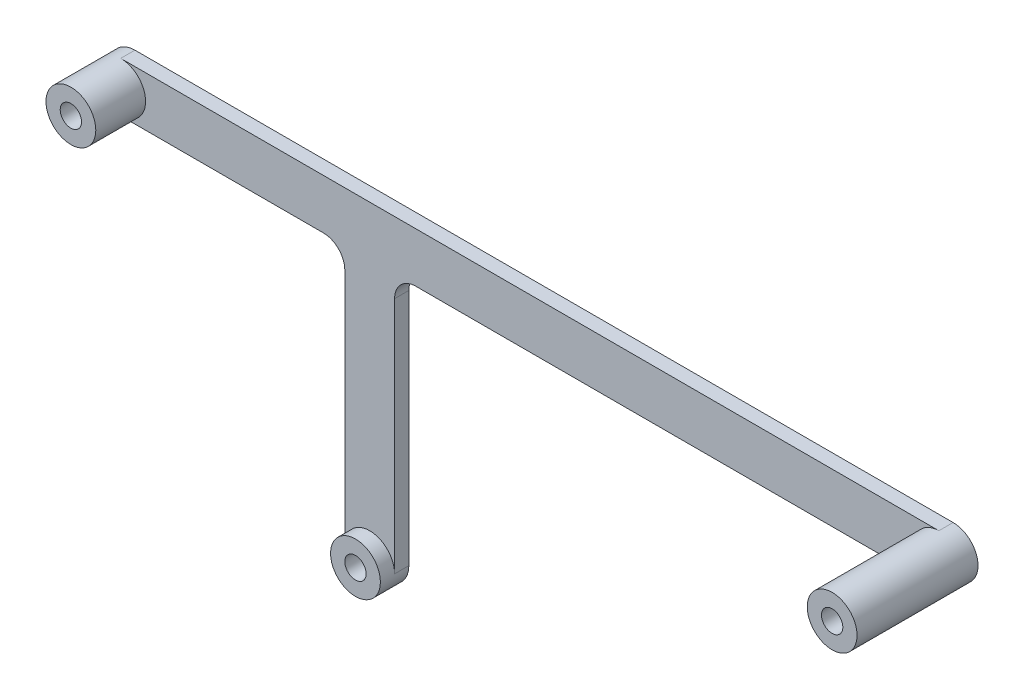
ISO-10303-21;
HEADER;
FILE_DESCRIPTION(('STEP AP214'),'2;1');
FILE_NAME('part.step','',(''),(''),'','','');
FILE_SCHEMA(('AUTOMOTIVE_DESIGN { 1 0 10303 214 1 1 1 1 }'));
ENDSEC;
DATA;
#1=APPLICATION_CONTEXT('core data for automotive mechanical design processes');
#2=APPLICATION_PROTOCOL_DEFINITION('international standard','automotive_design',2000,#1);
#3=PRODUCT_CONTEXT('',#1,'mechanical');
#4=PRODUCT('Part','Part','',(#3));
#5=PRODUCT_RELATED_PRODUCT_CATEGORY('part','',(#4));
#6=PRODUCT_DEFINITION_FORMATION('','',#4);
#7=PRODUCT_DEFINITION_CONTEXT('part definition',#1,'design');
#8=PRODUCT_DEFINITION('design','',#6,#7);
#9=PRODUCT_DEFINITION_SHAPE('','',#8);
#10=(LENGTH_UNIT() NAMED_UNIT(*) SI_UNIT(.MILLI.,.METRE.));
#11=(NAMED_UNIT(*) PLANE_ANGLE_UNIT() SI_UNIT($,.RADIAN.));
#12=(NAMED_UNIT(*) SI_UNIT($,.STERADIAN.) SOLID_ANGLE_UNIT());
#13=UNCERTAINTY_MEASURE_WITH_UNIT(LENGTH_MEASURE(1.E-05),#10,'distance_accuracy_value','');
#14=(GEOMETRIC_REPRESENTATION_CONTEXT(3) GLOBAL_UNCERTAINTY_ASSIGNED_CONTEXT((#13)) GLOBAL_UNIT_ASSIGNED_CONTEXT((#10,
#11,#12)) REPRESENTATION_CONTEXT('',''));
#15=CARTESIAN_POINT('',(0.,0.,0.));
#16=DIRECTION('',(0.,0.,1.));
#17=DIRECTION('',(1.,0.,0.));
#18=AXIS2_PLACEMENT_3D('',#15,#16,#17);
#19=CARTESIAN_POINT('',(-35.,40.,2.));
#20=DIRECTION('',(0.,0.,1.));
#21=DIRECTION('',(1.,0.,0.));
#22=AXIS2_PLACEMENT_3D('',#19,#20,#21);
#23=PLANE('',#22);
#24=DIRECTION('',(0.,-1.,0.));
#25=VECTOR('',#24,1.);
#26=CARTESIAN_POINT('',(-3.5,0.,2.));
#27=LINE('',#26,#25);
#28=CARTESIAN_POINT('',(-3.5,33.5,2.));
#29=VERTEX_POINT('',#28);
#30=CARTESIAN_POINT('',(-3.5,0.,2.));
#31=VERTEX_POINT('',#30);
#32=EDGE_CURVE('E137',#29,#31,#27,.T.);
#33=ORIENTED_EDGE('',*,*,#32,.T.);
#34=CARTESIAN_POINT('',(0.,0.,2.));
#35=DIRECTION('',(0.,0.,1.));
#36=DIRECTION('',(1.,0.,0.));
#37=AXIS2_PLACEMENT_3D('',#34,#35,#36);
#38=CIRCLE('',#37,3.5);
#39=CARTESIAN_POINT('',(3.5,0.,2.));
#40=VERTEX_POINT('',#39);
#41=EDGE_CURVE('E132',#40,#31,#38,.T.);
#42=ORIENTED_EDGE('',*,*,#41,.F.);
#43=DIRECTION('',(0.,1.,0.));
#44=VECTOR('',#43,1.);
#45=CARTESIAN_POINT('',(3.5,0.,2.));
#46=LINE('',#45,#44);
#47=CARTESIAN_POINT('',(3.5,33.5,2.));
#48=VERTEX_POINT('',#47);
#49=EDGE_CURVE('E125',#40,#48,#46,.T.);
#50=ORIENTED_EDGE('',*,*,#49,.T.);
#51=CARTESIAN_POINT('',(6.5,33.5,2.));
#52=DIRECTION('',(0.,0.,-1.));
#53=DIRECTION('',(1.,0.,0.));
#54=AXIS2_PLACEMENT_3D('',#51,#52,#53);
#55=CIRCLE('',#54,3.);
#56=CARTESIAN_POINT('',(6.50000000000002,36.5,2.));
#57=VERTEX_POINT('',#56);
#58=EDGE_CURVE('E128',#48,#57,#55,.T.);
#59=ORIENTED_EDGE('',*,*,#58,.T.);
#60=DIRECTION('',(1.,0.,0.));
#61=VECTOR('',#60,1.);
#62=CARTESIAN_POINT('',(6.50000000000002,36.5,2.));
#63=LINE('',#62,#61);
#64=CARTESIAN_POINT('',(80.,36.5,2.));
#65=VERTEX_POINT('',#64);
#66=EDGE_CURVE('E62',#57,#65,#63,.T.);
#67=ORIENTED_EDGE('',*,*,#66,.T.);
#68=CARTESIAN_POINT('',(80.,40.,2.));
#69=DIRECTION('',(0.,0.,1.));
#70=DIRECTION('',(1.,0.,0.));
#71=AXIS2_PLACEMENT_3D('',#68,#69,#70);
#72=CIRCLE('',#71,3.50000000000001);
#73=CARTESIAN_POINT('',(80.,43.5,2.));
#74=VERTEX_POINT('',#73);
#75=EDGE_CURVE('E264',#74,#65,#72,.T.);
#76=ORIENTED_EDGE('',*,*,#75,.F.);
#77=DIRECTION('',(-1.,0.,0.));
#78=VECTOR('',#77,1.);
#79=CARTESIAN_POINT('',(-35.,43.5,2.));
#80=LINE('',#79,#78);
#81=CARTESIAN_POINT('',(-35.,43.5,2.));
#82=VERTEX_POINT('',#81);
#83=EDGE_CURVE('E155',#74,#82,#80,.T.);
#84=ORIENTED_EDGE('',*,*,#83,.T.);
#85=CARTESIAN_POINT('',(-35.,40.,2.));
#86=DIRECTION('',(0.,0.,1.));
#87=DIRECTION('',(1.,0.,0.));
#88=AXIS2_PLACEMENT_3D('',#85,#86,#87);
#89=CIRCLE('',#88,3.5);
#90=CARTESIAN_POINT('',(-35.,36.5,2.));
#91=VERTEX_POINT('',#90);
#92=EDGE_CURVE('E11',#91,#82,#89,.T.);
#93=ORIENTED_EDGE('',*,*,#92,.F.);
#94=DIRECTION('',(1.,0.,0.));
#95=VECTOR('',#94,1.);
#96=CARTESIAN_POINT('',(-35.,36.5,2.));
#97=LINE('',#96,#95);
#98=CARTESIAN_POINT('',(-6.50000000000002,36.5,2.));
#99=VERTEX_POINT('',#98);
#100=EDGE_CURVE('E191',#91,#99,#97,.T.);
#101=ORIENTED_EDGE('',*,*,#100,.T.);
#102=CARTESIAN_POINT('',(-6.5,33.5,2.));
#103=DIRECTION('',(0.,0.,-1.));
#104=DIRECTION('',(-1.,0.,0.));
#105=AXIS2_PLACEMENT_3D('',#102,#103,#104);
#106=CIRCLE('',#105,3.);
#107=EDGE_CURVE('E238',#99,#29,#106,.T.);
#108=ORIENTED_EDGE('',*,*,#107,.T.);
#109=EDGE_LOOP('',(#33,#42,#50,#59,#67,#76,#84,#93,#101,#108));
#110=FACE_BOUND('',#109,.T.);
#111=ADVANCED_FACE('F43',(#110),#23,.T.);
#112=CARTESIAN_POINT('',(-35.,40.,0.));
#113=DIRECTION('',(0.,0.,1.));
#114=DIRECTION('',(1.,0.,0.));
#115=AXIS2_PLACEMENT_3D('',#112,#113,#114);
#116=PLANE('',#115);
#117=CARTESIAN_POINT('',(-35.,40.,0.));
#118=DIRECTION('',(0.,0.,1.));
#119=DIRECTION('',(1.,0.,0.));
#120=AXIS2_PLACEMENT_3D('',#117,#118,#119);
#121=CIRCLE('',#120,3.5);
#122=CARTESIAN_POINT('',(-35.,43.5,0.));
#123=VERTEX_POINT('',#122);
#124=CARTESIAN_POINT('',(-35.,36.5,0.));
#125=VERTEX_POINT('',#124);
#126=EDGE_CURVE('E162',#123,#125,#121,.T.);
#127=ORIENTED_EDGE('',*,*,#126,.F.);
#128=DIRECTION('',(-1.,0.,0.));
#129=VECTOR('',#128,1.);
#130=CARTESIAN_POINT('',(-35.,43.5,0.));
#131=LINE('',#130,#129);
#132=CARTESIAN_POINT('',(80.,43.5,0.));
#133=VERTEX_POINT('',#132);
#134=EDGE_CURVE('E105',#133,#123,#131,.T.);
#135=ORIENTED_EDGE('',*,*,#134,.F.);
#136=CARTESIAN_POINT('',(80.,40.,0.));
#137=DIRECTION('',(0.,0.,1.));
#138=DIRECTION('',(1.,0.,0.));
#139=AXIS2_PLACEMENT_3D('',#136,#137,#138);
#140=CIRCLE('',#139,3.5);
#141=CARTESIAN_POINT('',(80.,36.5,0.));
#142=VERTEX_POINT('',#141);
#143=EDGE_CURVE('E98',#142,#133,#140,.T.);
#144=ORIENTED_EDGE('',*,*,#143,.F.);
#145=DIRECTION('',(1.,0.,0.));
#146=VECTOR('',#145,1.);
#147=CARTESIAN_POINT('',(6.50000000000002,36.5,0.));
#148=LINE('',#147,#146);
#149=CARTESIAN_POINT('',(6.50000000000002,36.5,0.));
#150=VERTEX_POINT('',#149);
#151=EDGE_CURVE('E184',#150,#142,#148,.T.);
#152=ORIENTED_EDGE('',*,*,#151,.F.);
#153=CARTESIAN_POINT('',(6.5,33.5,0.));
#154=DIRECTION('',(0.,0.,-1.));
#155=DIRECTION('',(1.,0.,0.));
#156=AXIS2_PLACEMENT_3D('',#153,#154,#155);
#157=CIRCLE('',#156,3.);
#158=CARTESIAN_POINT('',(3.5,33.5,0.));
#159=VERTEX_POINT('',#158);
#160=EDGE_CURVE('E181',#159,#150,#157,.T.);
#161=ORIENTED_EDGE('',*,*,#160,.F.);
#162=DIRECTION('',(0.,1.,0.));
#163=VECTOR('',#162,1.);
#164=CARTESIAN_POINT('',(3.5,0.,0.));
#165=LINE('',#164,#163);
#166=CARTESIAN_POINT('',(3.5,0.,0.));
#167=VERTEX_POINT('',#166);
#168=EDGE_CURVE('E143',#167,#159,#165,.T.);
#169=ORIENTED_EDGE('',*,*,#168,.F.);
#170=CARTESIAN_POINT('',(0.,0.,0.));
#171=DIRECTION('',(0.,0.,1.));
#172=DIRECTION('',(1.,0.,0.));
#173=AXIS2_PLACEMENT_3D('',#170,#171,#172);
#174=CIRCLE('',#173,3.5);
#175=CARTESIAN_POINT('',(-3.5,0.,0.));
#176=VERTEX_POINT('',#175);
#177=EDGE_CURVE('E176',#176,#167,#174,.T.);
#178=ORIENTED_EDGE('',*,*,#177,.F.);
#179=DIRECTION('',(0.,-1.,0.));
#180=VECTOR('',#179,1.);
#181=CARTESIAN_POINT('',(-3.5,0.,0.));
#182=LINE('',#181,#180);
#183=CARTESIAN_POINT('',(-3.5,33.5,0.));
#184=VERTEX_POINT('',#183);
#185=EDGE_CURVE('E173',#184,#176,#182,.T.);
#186=ORIENTED_EDGE('',*,*,#185,.F.);
#187=CARTESIAN_POINT('',(-6.5,33.5,0.));
#188=DIRECTION('',(0.,0.,-1.));
#189=DIRECTION('',(-1.,0.,0.));
#190=AXIS2_PLACEMENT_3D('',#187,#188,#189);
#191=CIRCLE('',#190,3.);
#192=CARTESIAN_POINT('',(-6.50000000000002,36.5,0.));
#193=VERTEX_POINT('',#192);
#194=EDGE_CURVE('E170',#193,#184,#191,.T.);
#195=ORIENTED_EDGE('',*,*,#194,.F.);
#196=DIRECTION('',(1.,0.,0.));
#197=VECTOR('',#196,1.);
#198=CARTESIAN_POINT('',(-35.,36.5,0.));
#199=LINE('',#198,#197);
#200=EDGE_CURVE('E166',#125,#193,#199,.T.);
#201=ORIENTED_EDGE('',*,*,#200,.F.);
#202=EDGE_LOOP('',(#127,#135,#144,#152,#161,#169,#178,#186,#195,#201));
#203=FACE_BOUND('',#202,.T.);
#204=CARTESIAN_POINT('',(-35.,40.,0.));
#205=DIRECTION('',(0.,0.,1.));
#206=DIRECTION('',(1.,0.,0.));
#207=AXIS2_PLACEMENT_3D('',#204,#205,#206);
#208=CIRCLE('',#207,1.5);
#209=CARTESIAN_POINT('',(-33.5,40.,0.));
#210=VERTEX_POINT('',#209);
#211=EDGE_CURVE('E167',#210,#210,#208,.T.);
#212=ORIENTED_EDGE('',*,*,#211,.T.);
#213=EDGE_LOOP('',(#212));
#214=FACE_BOUND('',#213,.T.);
#215=CARTESIAN_POINT('',(80.,40.,0.));
#216=DIRECTION('',(0.,0.,1.));
#217=DIRECTION('',(1.,0.,0.));
#218=AXIS2_PLACEMENT_3D('',#215,#216,#217);
#219=CIRCLE('',#218,1.5);
#220=CARTESIAN_POINT('',(81.5,40.,0.));
#221=VERTEX_POINT('',#220);
#222=EDGE_CURVE('E247',#221,#221,#219,.T.);
#223=ORIENTED_EDGE('',*,*,#222,.T.);
#224=EDGE_LOOP('',(#223));
#225=FACE_BOUND('',#224,.T.);
#226=CARTESIAN_POINT('',(0.,0.,0.));
#227=DIRECTION('',(0.,0.,1.));
#228=DIRECTION('',(1.,0.,0.));
#229=AXIS2_PLACEMENT_3D('',#226,#227,#228);
#230=CIRCLE('',#229,1.5);
#231=CARTESIAN_POINT('',(1.5,0.,0.));
#232=VERTEX_POINT('',#231);
#233=EDGE_CURVE('E251',#232,#232,#230,.T.);
#234=ORIENTED_EDGE('',*,*,#233,.T.);
#235=EDGE_LOOP('',(#234));
#236=FACE_BOUND('',#235,.T.);
#237=ADVANCED_FACE('F227',(#203,#214,#225,#236),#116,.F.);
#238=CARTESIAN_POINT('',(-35.,40.,2.));
#239=DIRECTION('',(0.,0.,-1.));
#240=DIRECTION('',(-1.,0.,0.));
#241=AXIS2_PLACEMENT_3D('',#238,#239,#240);
#242=CYLINDRICAL_SURFACE('',#241,3.5);
#243=ORIENTED_EDGE('',*,*,#126,.T.);
#244=DIRECTION('',(0.,0.,-1.));
#245=VECTOR('',#244,1.);
#246=CARTESIAN_POINT('',(-35.,36.5,2.));
#247=LINE('',#246,#245);
#248=EDGE_CURVE('E47',#91,#125,#247,.T.);
#249=ORIENTED_EDGE('',*,*,#248,.F.);
#250=ORIENTED_EDGE('',*,*,#92,.T.);
#251=DIRECTION('',(0.,0.,-1.));
#252=VECTOR('',#251,1.);
#253=CARTESIAN_POINT('',(-35.,43.5,2.));
#254=LINE('',#253,#252);
#255=EDGE_CURVE('E161',#82,#123,#254,.T.);
#256=ORIENTED_EDGE('',*,*,#255,.T.);
#257=EDGE_LOOP('',(#243,#249,#250,#256));
#258=FACE_BOUND('',#257,.T.);
#259=CARTESIAN_POINT('',(-35.,40.,9.));
#260=DIRECTION('',(0.,0.,1.));
#261=DIRECTION('',(1.,0.,0.));
#262=AXIS2_PLACEMENT_3D('',#259,#260,#261);
#263=CIRCLE('',#262,3.5);
#264=CARTESIAN_POINT('',(-31.5,40.,9.));
#265=VERTEX_POINT('',#264);
#266=EDGE_CURVE('E254',#265,#265,#263,.T.);
#267=ORIENTED_EDGE('',*,*,#266,.F.);
#268=EDGE_LOOP('',(#267));
#269=FACE_BOUND('',#268,.T.);
#270=ADVANCED_FACE('F45',(#258,#269),#242,.T.);
#271=CARTESIAN_POINT('',(-35.,36.5,2.));
#272=DIRECTION('',(0.,1.,0.));
#273=DIRECTION('',(0.,0.,1.));
#274=AXIS2_PLACEMENT_3D('',#271,#272,#273);
#275=PLANE('',#274);
#276=ORIENTED_EDGE('',*,*,#200,.T.);
#277=DIRECTION('',(0.,0.,-1.));
#278=VECTOR('',#277,1.);
#279=CARTESIAN_POINT('',(-6.50000000000002,36.5,2.));
#280=LINE('',#279,#278);
#281=EDGE_CURVE('E211',#99,#193,#280,.T.);
#282=ORIENTED_EDGE('',*,*,#281,.F.);
#283=ORIENTED_EDGE('',*,*,#100,.F.);
#284=ORIENTED_EDGE('',*,*,#248,.T.);
#285=EDGE_LOOP('',(#276,#282,#283,#284));
#286=FACE_BOUND('',#285,.T.);
#287=ADVANCED_FACE('F222',(#286),#275,.F.);
#288=CARTESIAN_POINT('',(-6.5,33.5,2.));
#289=DIRECTION('',(0.,0.,-1.));
#290=DIRECTION('',(-1.,0.,0.));
#291=AXIS2_PLACEMENT_3D('',#288,#289,#290);
#292=CYLINDRICAL_SURFACE('',#291,3.);
#293=ORIENTED_EDGE('',*,*,#194,.T.);
#294=DIRECTION('',(0.,0.,-1.));
#295=VECTOR('',#294,1.);
#296=CARTESIAN_POINT('',(-3.5,33.5,2.));
#297=LINE('',#296,#295);
#298=EDGE_CURVE('E208',#29,#184,#297,.T.);
#299=ORIENTED_EDGE('',*,*,#298,.F.);
#300=ORIENTED_EDGE('',*,*,#107,.F.);
#301=ORIENTED_EDGE('',*,*,#281,.T.);
#302=EDGE_LOOP('',(#293,#299,#300,#301));
#303=FACE_BOUND('',#302,.T.);
#304=ADVANCED_FACE('F232',(#303),#292,.F.);
#305=CARTESIAN_POINT('',(-3.5,0.,2.));
#306=DIRECTION('',(1.,0.,0.));
#307=DIRECTION('',(0.,1.,0.));
#308=AXIS2_PLACEMENT_3D('',#305,#306,#307);
#309=PLANE('',#308);
#310=ORIENTED_EDGE('',*,*,#185,.T.);
#311=DIRECTION('',(0.,0.,-1.));
#312=VECTOR('',#311,1.);
#313=CARTESIAN_POINT('',(-3.5,0.,2.));
#314=LINE('',#313,#312);
#315=EDGE_CURVE('E204',#31,#176,#314,.T.);
#316=ORIENTED_EDGE('',*,*,#315,.F.);
#317=ORIENTED_EDGE('',*,*,#32,.F.);
#318=ORIENTED_EDGE('',*,*,#298,.T.);
#319=EDGE_LOOP('',(#310,#316,#317,#318));
#320=FACE_BOUND('',#319,.T.);
#321=ADVANCED_FACE('F235',(#320),#309,.F.);
#322=CARTESIAN_POINT('',(0.,0.,2.));
#323=DIRECTION('',(0.,0.,-1.));
#324=DIRECTION('',(-1.,0.,0.));
#325=AXIS2_PLACEMENT_3D('',#322,#323,#324);
#326=CYLINDRICAL_SURFACE('',#325,3.5);
#327=ORIENTED_EDGE('',*,*,#177,.T.);
#328=DIRECTION('',(0.,0.,-1.));
#329=VECTOR('',#328,1.);
#330=CARTESIAN_POINT('',(3.5,0.,2.));
#331=LINE('',#330,#329);
#332=EDGE_CURVE('E147',#40,#167,#331,.T.);
#333=ORIENTED_EDGE('',*,*,#332,.F.);
#334=ORIENTED_EDGE('',*,*,#41,.T.);
#335=ORIENTED_EDGE('',*,*,#315,.T.);
#336=EDGE_LOOP('',(#327,#333,#334,#335));
#337=FACE_BOUND('',#336,.T.);
#338=CARTESIAN_POINT('',(0.,0.,4.));
#339=DIRECTION('',(0.,0.,1.));
#340=DIRECTION('',(1.,0.,0.));
#341=AXIS2_PLACEMENT_3D('',#338,#339,#340);
#342=CIRCLE('',#341,3.5);
#343=CARTESIAN_POINT('',(3.5,0.,4.));
#344=VERTEX_POINT('',#343);
#345=EDGE_CURVE('E275',#344,#344,#342,.T.);
#346=ORIENTED_EDGE('',*,*,#345,.F.);
#347=EDGE_LOOP('',(#346));
#348=FACE_BOUND('',#347,.T.);
#349=ADVANCED_FACE('F326',(#337,#348),#326,.T.);
#350=CARTESIAN_POINT('',(3.5,0.,2.));
#351=DIRECTION('',(-1.,0.,0.));
#352=DIRECTION('',(0.,0.,1.));
#353=AXIS2_PLACEMENT_3D('',#350,#351,#352);
#354=PLANE('',#353);
#355=ORIENTED_EDGE('',*,*,#168,.T.);
#356=DIRECTION('',(0.,0.,-1.));
#357=VECTOR('',#356,1.);
#358=CARTESIAN_POINT('',(3.5,33.5,2.));
#359=LINE('',#358,#357);
#360=EDGE_CURVE('E140',#48,#159,#359,.T.);
#361=ORIENTED_EDGE('',*,*,#360,.F.);
#362=ORIENTED_EDGE('',*,*,#49,.F.);
#363=ORIENTED_EDGE('',*,*,#332,.T.);
#364=EDGE_LOOP('',(#355,#361,#362,#363));
#365=FACE_BOUND('',#364,.T.);
#366=ADVANCED_FACE('F141',(#365),#354,.F.);
#367=CARTESIAN_POINT('',(6.5,33.5,2.));
#368=DIRECTION('',(0.,0.,-1.));
#369=DIRECTION('',(-1.,0.,0.));
#370=AXIS2_PLACEMENT_3D('',#367,#368,#369);
#371=CYLINDRICAL_SURFACE('',#370,3.);
#372=ORIENTED_EDGE('',*,*,#160,.T.);
#373=DIRECTION('',(0.,0.,-1.));
#374=VECTOR('',#373,1.);
#375=CARTESIAN_POINT('',(6.50000000000002,36.5,2.));
#376=LINE('',#375,#374);
#377=EDGE_CURVE('E148',#57,#150,#376,.T.);
#378=ORIENTED_EDGE('',*,*,#377,.F.);
#379=ORIENTED_EDGE('',*,*,#58,.F.);
#380=ORIENTED_EDGE('',*,*,#360,.T.);
#381=EDGE_LOOP('',(#372,#378,#379,#380));
#382=FACE_BOUND('',#381,.T.);
#383=ADVANCED_FACE('F150',(#382),#371,.F.);
#384=CARTESIAN_POINT('',(6.50000000000002,36.5,2.));
#385=DIRECTION('',(0.,1.,0.));
#386=DIRECTION('',(-1.,0.,0.));
#387=AXIS2_PLACEMENT_3D('',#384,#385,#386);
#388=PLANE('',#387);
#389=ORIENTED_EDGE('',*,*,#151,.T.);
#390=DIRECTION('',(0.,0.,-1.));
#391=VECTOR('',#390,1.);
#392=CARTESIAN_POINT('',(80.,36.5,2.));
#393=LINE('',#392,#391);
#394=EDGE_CURVE('E197',#65,#142,#393,.T.);
#395=ORIENTED_EDGE('',*,*,#394,.F.);
#396=ORIENTED_EDGE('',*,*,#66,.F.);
#397=ORIENTED_EDGE('',*,*,#377,.T.);
#398=EDGE_LOOP('',(#389,#395,#396,#397));
#399=FACE_BOUND('',#398,.T.);
#400=ADVANCED_FACE('F318',(#399),#388,.F.);
#401=CARTESIAN_POINT('',(80.,40.,2.));
#402=DIRECTION('',(0.,0.,-1.));
#403=DIRECTION('',(-1.,0.,0.));
#404=AXIS2_PLACEMENT_3D('',#401,#402,#403);
#405=CYLINDRICAL_SURFACE('',#404,3.5);
#406=ORIENTED_EDGE('',*,*,#143,.T.);
#407=DIRECTION('',(0.,0.,-1.));
#408=VECTOR('',#407,1.);
#409=CARTESIAN_POINT('',(80.,43.5,2.));
#410=LINE('',#409,#408);
#411=EDGE_CURVE('E194',#74,#133,#410,.T.);
#412=ORIENTED_EDGE('',*,*,#411,.F.);
#413=ORIENTED_EDGE('',*,*,#75,.T.);
#414=ORIENTED_EDGE('',*,*,#394,.T.);
#415=EDGE_LOOP('',(#406,#412,#413,#414));
#416=FACE_BOUND('',#415,.T.);
#417=CARTESIAN_POINT('',(80.,40.,17.));
#418=DIRECTION('',(0.,0.,1.));
#419=DIRECTION('',(1.,0.,0.));
#420=AXIS2_PLACEMENT_3D('',#417,#418,#419);
#421=CIRCLE('',#420,3.50000000000001);
#422=CARTESIAN_POINT('',(83.5,40.,17.));
#423=VERTEX_POINT('',#422);
#424=EDGE_CURVE('E263',#423,#423,#421,.T.);
#425=ORIENTED_EDGE('',*,*,#424,.F.);
#426=EDGE_LOOP('',(#425));
#427=FACE_BOUND('',#426,.T.);
#428=ADVANCED_FACE('F315',(#416,#427),#405,.T.);
#429=CARTESIAN_POINT('',(-35.,43.5,2.));
#430=DIRECTION('',(0.,-1.,0.));
#431=DIRECTION('',(0.,0.,-1.));
#432=AXIS2_PLACEMENT_3D('',#429,#430,#431);
#433=PLANE('',#432);
#434=ORIENTED_EDGE('',*,*,#134,.T.);
#435=ORIENTED_EDGE('',*,*,#255,.F.);
#436=ORIENTED_EDGE('',*,*,#83,.F.);
#437=ORIENTED_EDGE('',*,*,#411,.T.);
#438=EDGE_LOOP('',(#434,#435,#436,#437));
#439=FACE_BOUND('',#438,.T.);
#440=ADVANCED_FACE('F312',(#439),#433,.F.);
#441=CARTESIAN_POINT('',(-35.,40.,2.));
#442=DIRECTION('',(0.,0.,-1.));
#443=DIRECTION('',(-1.,0.,0.));
#444=AXIS2_PLACEMENT_3D('',#441,#442,#443);
#445=CYLINDRICAL_SURFACE('',#444,1.5);
#446=ORIENTED_EDGE('',*,*,#211,.F.);
#447=EDGE_LOOP('',(#446));
#448=FACE_BOUND('',#447,.T.);
#449=CARTESIAN_POINT('',(-35.,40.,9.));
#450=DIRECTION('',(0.,0.,1.));
#451=DIRECTION('',(1.,0.,0.));
#452=AXIS2_PLACEMENT_3D('',#449,#450,#451);
#453=CIRCLE('',#452,1.5);
#454=CARTESIAN_POINT('',(-33.5,40.,9.));
#455=VERTEX_POINT('',#454);
#456=EDGE_CURVE('E259',#455,#455,#453,.T.);
#457=ORIENTED_EDGE('',*,*,#456,.T.);
#458=EDGE_LOOP('',(#457));
#459=FACE_BOUND('',#458,.T.);
#460=ADVANCED_FACE('F309',(#448,#459),#445,.F.);
#461=CARTESIAN_POINT('',(80.,40.,2.));
#462=DIRECTION('',(0.,0.,-1.));
#463=DIRECTION('',(-1.,0.,0.));
#464=AXIS2_PLACEMENT_3D('',#461,#462,#463);
#465=CYLINDRICAL_SURFACE('',#464,1.5);
#466=ORIENTED_EDGE('',*,*,#222,.F.);
#467=EDGE_LOOP('',(#466));
#468=FACE_BOUND('',#467,.T.);
#469=CARTESIAN_POINT('',(80.,40.,17.));
#470=DIRECTION('',(0.,0.,1.));
#471=DIRECTION('',(1.,0.,0.));
#472=AXIS2_PLACEMENT_3D('',#469,#470,#471);
#473=CIRCLE('',#472,1.5);
#474=CARTESIAN_POINT('',(81.5,40.,17.));
#475=VERTEX_POINT('',#474);
#476=EDGE_CURVE('E268',#475,#475,#473,.T.);
#477=ORIENTED_EDGE('',*,*,#476,.T.);
#478=EDGE_LOOP('',(#477));
#479=FACE_BOUND('',#478,.T.);
#480=ADVANCED_FACE('F389',(#468,#479),#465,.F.);
#481=CARTESIAN_POINT('',(0.,0.,2.));
#482=DIRECTION('',(0.,0.,-1.));
#483=DIRECTION('',(-1.,0.,0.));
#484=AXIS2_PLACEMENT_3D('',#481,#482,#483);
#485=CYLINDRICAL_SURFACE('',#484,1.5);
#486=ORIENTED_EDGE('',*,*,#233,.F.);
#487=EDGE_LOOP('',(#486));
#488=FACE_BOUND('',#487,.T.);
#489=CARTESIAN_POINT('',(0.,0.,4.));
#490=DIRECTION('',(0.,0.,1.));
#491=DIRECTION('',(1.,0.,0.));
#492=AXIS2_PLACEMENT_3D('',#489,#490,#491);
#493=CIRCLE('',#492,1.5);
#494=CARTESIAN_POINT('',(1.5,0.,4.));
#495=VERTEX_POINT('',#494);
#496=EDGE_CURVE('E278',#495,#495,#493,.T.);
#497=ORIENTED_EDGE('',*,*,#496,.T.);
#498=EDGE_LOOP('',(#497));
#499=FACE_BOUND('',#498,.T.);
#500=ADVANCED_FACE('F286',(#488,#499),#485,.F.);
#501=CARTESIAN_POINT('',(-35.,40.,9.));
#502=DIRECTION('',(0.,0.,1.));
#503=DIRECTION('',(1.,0.,0.));
#504=AXIS2_PLACEMENT_3D('',#501,#502,#503);
#505=PLANE('',#504);
#506=ORIENTED_EDGE('',*,*,#266,.T.);
#507=EDGE_LOOP('',(#506));
#508=FACE_BOUND('',#507,.T.);
#509=ORIENTED_EDGE('',*,*,#456,.F.);
#510=EDGE_LOOP('',(#509));
#511=FACE_BOUND('',#510,.T.);
#512=ADVANCED_FACE('F297',(#508,#511),#505,.T.);
#513=CARTESIAN_POINT('',(80.,40.,17.));
#514=DIRECTION('',(0.,0.,1.));
#515=DIRECTION('',(1.,0.,0.));
#516=AXIS2_PLACEMENT_3D('',#513,#514,#515);
#517=PLANE('',#516);
#518=ORIENTED_EDGE('',*,*,#424,.T.);
#519=EDGE_LOOP('',(#518));
#520=FACE_BOUND('',#519,.T.);
#521=ORIENTED_EDGE('',*,*,#476,.F.);
#522=EDGE_LOOP('',(#521));
#523=FACE_BOUND('',#522,.T.);
#524=ADVANCED_FACE('F290',(#520,#523),#517,.T.);
#525=CARTESIAN_POINT('',(0.,0.,4.));
#526=DIRECTION('',(0.,0.,1.));
#527=DIRECTION('',(1.,0.,0.));
#528=AXIS2_PLACEMENT_3D('',#525,#526,#527);
#529=PLANE('',#528);
#530=ORIENTED_EDGE('',*,*,#345,.T.);
#531=EDGE_LOOP('',(#530));
#532=FACE_BOUND('',#531,.T.);
#533=ORIENTED_EDGE('',*,*,#496,.F.);
#534=EDGE_LOOP('',(#533));
#535=FACE_BOUND('',#534,.T.);
#536=ADVANCED_FACE('F288',(#532,#535),#529,.T.);
#537=CLOSED_SHELL('',(#111,#237,#270,#287,#304,#321,#349,#366,#383,#400,#428,#440,#460,#480,
#500,#512,#524,#536));
#538=MANIFOLD_SOLID_BREP('B2',#537);
#539=ADVANCED_BREP_SHAPE_REPRESENTATION('',(#18,#538),#14);
#540=SHAPE_DEFINITION_REPRESENTATION(#9,#539);
ENDSEC;
END-ISO-10303-21;
